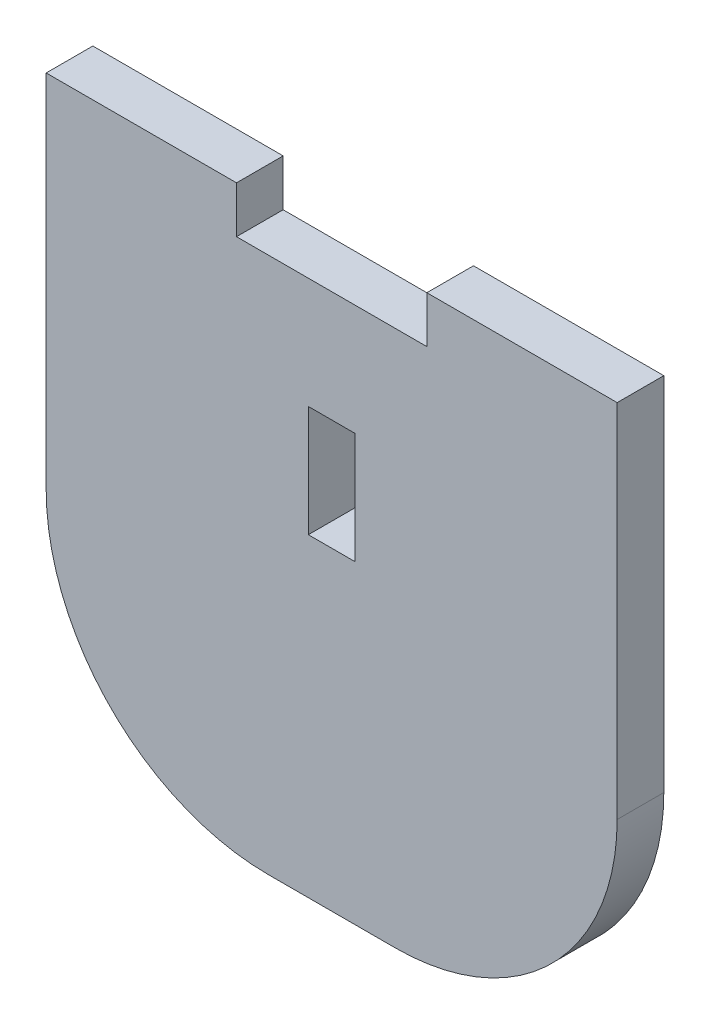
ISO-10303-21;
HEADER;
FILE_DESCRIPTION(('STEP AP214'),'2;1');
FILE_NAME('part.step','',(''),(''),'','','');
FILE_SCHEMA(('AUTOMOTIVE_DESIGN { 1 0 10303 214 1 1 1 1 }'));
ENDSEC;
DATA;
#1=APPLICATION_CONTEXT('core data for automotive mechanical design processes');
#2=APPLICATION_PROTOCOL_DEFINITION('international standard','automotive_design',2000,#1);
#3=PRODUCT_CONTEXT('',#1,'mechanical');
#4=PRODUCT('Part','Part','',(#3));
#5=PRODUCT_RELATED_PRODUCT_CATEGORY('part','',(#4));
#6=PRODUCT_DEFINITION_FORMATION('','',#4);
#7=PRODUCT_DEFINITION_CONTEXT('part definition',#1,'design');
#8=PRODUCT_DEFINITION('design','',#6,#7);
#9=PRODUCT_DEFINITION_SHAPE('','',#8);
#10=(LENGTH_UNIT() NAMED_UNIT(*) SI_UNIT(.MILLI.,.METRE.));
#11=(NAMED_UNIT(*) PLANE_ANGLE_UNIT() SI_UNIT($,.RADIAN.));
#12=(NAMED_UNIT(*) SI_UNIT($,.STERADIAN.) SOLID_ANGLE_UNIT());
#13=UNCERTAINTY_MEASURE_WITH_UNIT(LENGTH_MEASURE(1.E-05),#10,'distance_accuracy_value','');
#14=(GEOMETRIC_REPRESENTATION_CONTEXT(3) GLOBAL_UNCERTAINTY_ASSIGNED_CONTEXT((#13)) GLOBAL_UNIT_ASSIGNED_CONTEXT((#10,
#11,#12)) REPRESENTATION_CONTEXT('',''));
#15=CARTESIAN_POINT('',(0.,0.,0.));
#16=DIRECTION('',(0.,0.,1.));
#17=DIRECTION('',(1.,0.,0.));
#18=AXIS2_PLACEMENT_3D('',#15,#16,#17);
#19=CARTESIAN_POINT('',(-95.7751179129446,117.382455914664,5.334));
#20=DIRECTION('',(0.,-1.,0.));
#21=DIRECTION('',(0.,0.,-1.));
#22=AXIS2_PLACEMENT_3D('',#19,#20,#21);
#23=PLANE('',#22);
#24=DIRECTION('',(-1.,0.,0.));
#25=VECTOR('',#24,1.);
#26=CARTESIAN_POINT('',(-95.7751179129446,117.382455914664,5.334));
#27=LINE('',#26,#25);
#28=CARTESIAN_POINT('',(-74.0157845796113,117.382455914664,5.334));
#29=VERTEX_POINT('',#28);
#30=CARTESIAN_POINT('',(-95.7751179129446,117.382455914664,5.334));
#31=VERTEX_POINT('',#30);
#32=EDGE_CURVE('E205',#29,#31,#27,.T.);
#33=ORIENTED_EDGE('',*,*,#32,.F.);
#34=DIRECTION('',(0.,0.,1.));
#35=VECTOR('',#34,1.);
#36=CARTESIAN_POINT('',(-74.0157845796113,117.382455914664,0.));
#37=LINE('',#36,#35);
#38=CARTESIAN_POINT('',(-74.0157845796113,117.382455914664,0.));
#39=VERTEX_POINT('',#38);
#40=EDGE_CURVE('E187',#39,#29,#37,.T.);
#41=ORIENTED_EDGE('',*,*,#40,.F.);
#42=DIRECTION('',(-1.,0.,0.));
#43=VECTOR('',#42,1.);
#44=CARTESIAN_POINT('',(-95.7751179129446,117.382455914664,0.));
#45=LINE('',#44,#43);
#46=CARTESIAN_POINT('',(-95.7751179129446,117.382455914664,0.));
#47=VERTEX_POINT('',#46);
#48=EDGE_CURVE('E217',#39,#47,#45,.T.);
#49=ORIENTED_EDGE('',*,*,#48,.T.);
#50=DIRECTION('',(0.,0.,-1.));
#51=VECTOR('',#50,1.);
#52=CARTESIAN_POINT('',(-95.7751179129446,117.382455914664,5.334));
#53=LINE('',#52,#51);
#54=EDGE_CURVE('E209',#31,#47,#53,.T.);
#55=ORIENTED_EDGE('',*,*,#54,.F.);
#56=EDGE_LOOP('',(#33,#41,#49,#55));
#57=FACE_BOUND('',#56,.T.);
#58=ADVANCED_FACE('F33',(#57),#23,.F.);
#59=CARTESIAN_POINT('',(-95.7751179129446,117.382455914664,5.334));
#60=DIRECTION('',(1.,0.,0.));
#61=DIRECTION('',(0.,1.,0.));
#62=AXIS2_PLACEMENT_3D('',#59,#60,#61);
#63=PLANE('',#62);
#64=DIRECTION('',(0.,-1.,0.));
#65=VECTOR('',#64,1.);
#66=CARTESIAN_POINT('',(-95.7751179129446,117.382455914664,0.));
#67=LINE('',#66,#65);
#68=CARTESIAN_POINT('',(-95.7751179129446,76.107455914664,0.));
#69=VERTEX_POINT('',#68);
#70=EDGE_CURVE('E189',#47,#69,#67,.T.);
#71=ORIENTED_EDGE('',*,*,#70,.T.);
#72=DIRECTION('',(0.,0.,-1.));
#73=VECTOR('',#72,1.);
#74=CARTESIAN_POINT('',(-95.7751179129446,76.107455914664,5.334));
#75=LINE('',#74,#73);
#76=CARTESIAN_POINT('',(-95.7751179129446,76.107455914664,5.334));
#77=VERTEX_POINT('',#76);
#78=EDGE_CURVE('E230',#69,#77,#75,.F.);
#79=ORIENTED_EDGE('',*,*,#78,.T.);
#80=DIRECTION('',(0.,-1.,0.));
#81=VECTOR('',#80,1.);
#82=CARTESIAN_POINT('',(-95.7751179129446,117.382455914664,5.334));
#83=LINE('',#82,#81);
#84=EDGE_CURVE('E196',#31,#77,#83,.T.);
#85=ORIENTED_EDGE('',*,*,#84,.F.);
#86=ORIENTED_EDGE('',*,*,#54,.T.);
#87=EDGE_LOOP('',(#71,#79,#85,#86));
#88=FACE_BOUND('',#87,.T.);
#89=ADVANCED_FACE('F278',(#88),#63,.F.);
#90=CARTESIAN_POINT('',(-95.7751179129446,50.707455914664,5.334));
#91=DIRECTION('',(0.,1.,0.));
#92=DIRECTION('',(0.,0.,1.));
#93=AXIS2_PLACEMENT_3D('',#90,#91,#92);
#94=PLANE('',#93);
#95=DIRECTION('',(1.,0.,0.));
#96=VECTOR('',#95,1.);
#97=CARTESIAN_POINT('',(-95.7751179129446,50.707455914664,0.));
#98=LINE('',#97,#96);
#99=CARTESIAN_POINT('',(-70.3751179129446,50.707455914664,0.));
#100=VERTEX_POINT('',#99);
#101=CARTESIAN_POINT('',(-55.8971179129446,50.707455914664,0.));
#102=VERTEX_POINT('',#101);
#103=EDGE_CURVE('E212',#100,#102,#98,.T.);
#104=ORIENTED_EDGE('',*,*,#103,.T.);
#105=DIRECTION('',(0.,0.,-1.));
#106=VECTOR('',#105,1.);
#107=CARTESIAN_POINT('',(-55.8971179129446,50.707455914664,5.334));
#108=LINE('',#107,#106);
#109=CARTESIAN_POINT('',(-55.8971179129446,50.707455914664,5.334));
#110=VERTEX_POINT('',#109);
#111=EDGE_CURVE('E41',#102,#110,#108,.F.);
#112=ORIENTED_EDGE('',*,*,#111,.T.);
#113=DIRECTION('',(1.,0.,0.));
#114=VECTOR('',#113,1.);
#115=CARTESIAN_POINT('',(-95.7751179129446,50.707455914664,5.334));
#116=LINE('',#115,#114);
#117=CARTESIAN_POINT('',(-70.3751179129446,50.707455914664,5.334));
#118=VERTEX_POINT('',#117);
#119=EDGE_CURVE('E199',#118,#110,#116,.T.);
#120=ORIENTED_EDGE('',*,*,#119,.F.);
#121=DIRECTION('',(0.,0.,-1.));
#122=VECTOR('',#121,1.);
#123=CARTESIAN_POINT('',(-70.3751179129446,50.707455914664,5.334));
#124=LINE('',#123,#122);
#125=EDGE_CURVE('E225',#118,#100,#124,.T.);
#126=ORIENTED_EDGE('',*,*,#125,.T.);
#127=EDGE_LOOP('',(#104,#112,#120,#126));
#128=FACE_BOUND('',#127,.T.);
#129=ADVANCED_FACE('F241',(#128),#94,.F.);
#130=CARTESIAN_POINT('',(-30.4971179129446,117.382455914664,5.334));
#131=DIRECTION('',(-1.,0.,0.));
#132=DIRECTION('',(0.,-1.,0.));
#133=AXIS2_PLACEMENT_3D('',#130,#131,#132);
#134=PLANE('',#133);
#135=DIRECTION('',(0.,1.,0.));
#136=VECTOR('',#135,1.);
#137=CARTESIAN_POINT('',(-30.4971179129446,117.382455914664,5.334));
#138=LINE('',#137,#136);
#139=CARTESIAN_POINT('',(-30.4971179129446,76.107455914664,5.334));
#140=VERTEX_POINT('',#139);
#141=CARTESIAN_POINT('',(-30.4971179129446,117.382455914664,5.334));
#142=VERTEX_POINT('',#141);
#143=EDGE_CURVE('E203',#140,#142,#138,.T.);
#144=ORIENTED_EDGE('',*,*,#143,.F.);
#145=DIRECTION('',(0.,0.,-1.));
#146=VECTOR('',#145,1.);
#147=CARTESIAN_POINT('',(-30.4971179129446,76.107455914664,5.334));
#148=LINE('',#147,#146);
#149=CARTESIAN_POINT('',(-30.4971179129446,76.107455914664,0.));
#150=VERTEX_POINT('',#149);
#151=EDGE_CURVE('E234',#140,#150,#148,.T.);
#152=ORIENTED_EDGE('',*,*,#151,.T.);
#153=DIRECTION('',(0.,1.,0.));
#154=VECTOR('',#153,1.);
#155=CARTESIAN_POINT('',(-30.4971179129446,117.382455914664,0.));
#156=LINE('',#155,#154);
#157=CARTESIAN_POINT('',(-30.4971179129446,117.382455914664,0.));
#158=VERTEX_POINT('',#157);
#159=EDGE_CURVE('E215',#150,#158,#156,.T.);
#160=ORIENTED_EDGE('',*,*,#159,.T.);
#161=DIRECTION('',(0.,0.,-1.));
#162=VECTOR('',#161,1.);
#163=CARTESIAN_POINT('',(-30.4971179129446,117.382455914664,5.334));
#164=LINE('',#163,#162);
#165=EDGE_CURVE('E222',#142,#158,#164,.T.);
#166=ORIENTED_EDGE('',*,*,#165,.F.);
#167=EDGE_LOOP('',(#144,#152,#160,#166));
#168=FACE_BOUND('',#167,.T.);
#169=ADVANCED_FACE('F253',(#168),#134,.F.);
#170=CARTESIAN_POINT('',(-52.2564512462779,117.382455914664,0.));
#171=VERTEX_POINT('',#170);
#172=EDGE_CURVE('E200',#158,#171,#45,.T.);
#173=ORIENTED_EDGE('',*,*,#172,.T.);
#174=DIRECTION('',(0.,0.,1.));
#175=VECTOR('',#174,1.);
#176=CARTESIAN_POINT('',(-52.2564512462779,117.382455914664,0.));
#177=LINE('',#176,#175);
#178=CARTESIAN_POINT('',(-52.2564512462779,117.382455914664,5.334));
#179=VERTEX_POINT('',#178);
#180=EDGE_CURVE('E190',#171,#179,#177,.T.);
#181=ORIENTED_EDGE('',*,*,#180,.T.);
#182=EDGE_CURVE('E206',#142,#179,#27,.T.);
#183=ORIENTED_EDGE('',*,*,#182,.F.);
#184=ORIENTED_EDGE('',*,*,#165,.T.);
#185=EDGE_LOOP('',(#173,#181,#183,#184));
#186=FACE_BOUND('',#185,.T.);
#187=ADVANCED_FACE('F257',(#186),#23,.F.);
#188=CARTESIAN_POINT('',(0.,0.,5.334));
#189=DIRECTION('',(0.,0.,1.));
#190=DIRECTION('',(1.,0.,0.));
#191=AXIS2_PLACEMENT_3D('',#188,#189,#190);
#192=PLANE('',#191);
#193=DIRECTION('',(0.,-1.,0.));
#194=VECTOR('',#193,1.);
#195=CARTESIAN_POINT('',(-65.8031179129446,99.348455914664,5.334));
#196=LINE('',#195,#194);
#197=CARTESIAN_POINT('',(-65.8031179129446,99.348455914664,5.334));
#198=VERTEX_POINT('',#197);
#199=CARTESIAN_POINT('',(-65.8031179129446,86.648455914664,5.334));
#200=VERTEX_POINT('',#199);
#201=EDGE_CURVE('E48',#198,#200,#196,.T.);
#202=ORIENTED_EDGE('',*,*,#201,.F.);
#203=DIRECTION('',(-1.,0.,0.));
#204=VECTOR('',#203,1.);
#205=CARTESIAN_POINT('',(-65.8031179129446,99.348455914664,5.334));
#206=LINE('',#205,#204);
#207=CARTESIAN_POINT('',(-60.4691179129446,99.348455914664,5.334));
#208=VERTEX_POINT('',#207);
#209=EDGE_CURVE('E151',#208,#198,#206,.T.);
#210=ORIENTED_EDGE('',*,*,#209,.F.);
#211=DIRECTION('',(0.,1.,0.));
#212=VECTOR('',#211,1.);
#213=CARTESIAN_POINT('',(-60.4691179129446,99.348455914664,5.334));
#214=LINE('',#213,#212);
#215=CARTESIAN_POINT('',(-60.4691179129446,86.648455914664,5.334));
#216=VERTEX_POINT('',#215);
#217=EDGE_CURVE('E154',#216,#208,#214,.T.);
#218=ORIENTED_EDGE('',*,*,#217,.F.);
#219=DIRECTION('',(1.,0.,0.));
#220=VECTOR('',#219,1.);
#221=CARTESIAN_POINT('',(-65.8031179129446,86.648455914664,5.334));
#222=LINE('',#221,#220);
#223=EDGE_CURVE('E160',#200,#216,#222,.T.);
#224=ORIENTED_EDGE('',*,*,#223,.F.);
#225=EDGE_LOOP('',(#202,#210,#218,#224));
#226=FACE_BOUND('',#225,.T.);
#227=ORIENTED_EDGE('',*,*,#119,.T.);
#228=CARTESIAN_POINT('',(-55.8971179129446,76.107455914664,5.334));
#229=DIRECTION('',(0.,0.,1.));
#230=DIRECTION('',(1.,0.,0.));
#231=AXIS2_PLACEMENT_3D('',#228,#229,#230);
#232=CIRCLE('',#231,25.4);
#233=EDGE_CURVE('E11',#110,#140,#232,.T.);
#234=ORIENTED_EDGE('',*,*,#233,.T.);
#235=ORIENTED_EDGE('',*,*,#143,.T.);
#236=ORIENTED_EDGE('',*,*,#182,.T.);
#237=DIRECTION('',(0.,1.,0.));
#238=VECTOR('',#237,1.);
#239=CARTESIAN_POINT('',(-52.2564512462779,117.382455914664,5.334));
#240=LINE('',#239,#238);
#241=CARTESIAN_POINT('',(-52.2564512462779,112.048455914664,5.334));
#242=VERTEX_POINT('',#241);
#243=EDGE_CURVE('E174',#242,#179,#240,.T.);
#244=ORIENTED_EDGE('',*,*,#243,.F.);
#245=DIRECTION('',(1.,0.,0.));
#246=VECTOR('',#245,1.);
#247=CARTESIAN_POINT('',(-74.0157845796113,112.048455914664,5.334));
#248=LINE('',#247,#246);
#249=CARTESIAN_POINT('',(-74.0157845796113,112.048455914664,5.334));
#250=VERTEX_POINT('',#249);
#251=EDGE_CURVE('E183',#250,#242,#248,.T.);
#252=ORIENTED_EDGE('',*,*,#251,.F.);
#253=DIRECTION('',(0.,-1.,0.));
#254=VECTOR('',#253,1.);
#255=CARTESIAN_POINT('',(-74.0157845796113,117.382455914664,5.334));
#256=LINE('',#255,#254);
#257=EDGE_CURVE('E166',#29,#250,#256,.T.);
#258=ORIENTED_EDGE('',*,*,#257,.F.);
#259=ORIENTED_EDGE('',*,*,#32,.T.);
#260=ORIENTED_EDGE('',*,*,#84,.T.);
#261=CARTESIAN_POINT('',(-70.3751179129446,76.107455914664,5.334));
#262=DIRECTION('',(0.,0.,1.));
#263=DIRECTION('',(1.,0.,0.));
#264=AXIS2_PLACEMENT_3D('',#261,#262,#263);
#265=CIRCLE('',#264,25.4);
#266=EDGE_CURVE('E232',#77,#118,#265,.T.);
#267=ORIENTED_EDGE('',*,*,#266,.T.);
#268=EDGE_LOOP('',(#227,#234,#235,#236,#244,#252,#258,#259,#260,#267));
#269=FACE_BOUND('',#268,.T.);
#270=ADVANCED_FACE('F247',(#226,#269),#192,.T.);
#271=CARTESIAN_POINT('',(0.,0.,0.));
#272=DIRECTION('',(0.,0.,1.));
#273=DIRECTION('',(1.,0.,0.));
#274=AXIS2_PLACEMENT_3D('',#271,#272,#273);
#275=PLANE('',#274);
#276=DIRECTION('',(-1.,0.,0.));
#277=VECTOR('',#276,1.);
#278=CARTESIAN_POINT('',(-65.8031179129446,99.348455914664,0.));
#279=LINE('',#278,#277);
#280=CARTESIAN_POINT('',(-60.4691179129446,99.348455914664,0.));
#281=VERTEX_POINT('',#280);
#282=CARTESIAN_POINT('',(-65.8031179129446,99.348455914664,0.));
#283=VERTEX_POINT('',#282);
#284=EDGE_CURVE('E141',#281,#283,#279,.T.);
#285=ORIENTED_EDGE('',*,*,#284,.T.);
#286=DIRECTION('',(0.,-1.,0.));
#287=VECTOR('',#286,1.);
#288=CARTESIAN_POINT('',(-65.8031179129446,99.348455914664,0.));
#289=LINE('',#288,#287);
#290=CARTESIAN_POINT('',(-65.8031179129446,86.648455914664,0.));
#291=VERTEX_POINT('',#290);
#292=EDGE_CURVE('E135',#283,#291,#289,.T.);
#293=ORIENTED_EDGE('',*,*,#292,.T.);
#294=DIRECTION('',(1.,0.,0.));
#295=VECTOR('',#294,1.);
#296=CARTESIAN_POINT('',(-65.8031179129446,86.648455914664,0.));
#297=LINE('',#296,#295);
#298=CARTESIAN_POINT('',(-60.4691179129446,86.648455914664,0.));
#299=VERTEX_POINT('',#298);
#300=EDGE_CURVE('E144',#291,#299,#297,.T.);
#301=ORIENTED_EDGE('',*,*,#300,.T.);
#302=DIRECTION('',(0.,1.,0.));
#303=VECTOR('',#302,1.);
#304=CARTESIAN_POINT('',(-60.4691179129446,99.348455914664,0.));
#305=LINE('',#304,#303);
#306=EDGE_CURVE('E56',#299,#281,#305,.T.);
#307=ORIENTED_EDGE('',*,*,#306,.T.);
#308=EDGE_LOOP('',(#285,#293,#301,#307));
#309=FACE_BOUND('',#308,.T.);
#310=ORIENTED_EDGE('',*,*,#159,.F.);
#311=CARTESIAN_POINT('',(-55.8971179129446,76.107455914664,0.));
#312=DIRECTION('',(0.,0.,1.));
#313=DIRECTION('',(1.,0.,0.));
#314=AXIS2_PLACEMENT_3D('',#311,#312,#313);
#315=CIRCLE('',#314,25.4);
#316=EDGE_CURVE('E237',#150,#102,#315,.F.);
#317=ORIENTED_EDGE('',*,*,#316,.T.);
#318=ORIENTED_EDGE('',*,*,#103,.F.);
#319=CARTESIAN_POINT('',(-70.3751179129446,76.107455914664,0.));
#320=DIRECTION('',(0.,0.,1.));
#321=DIRECTION('',(1.,0.,0.));
#322=AXIS2_PLACEMENT_3D('',#319,#320,#321);
#323=CIRCLE('',#322,25.4);
#324=EDGE_CURVE('E228',#100,#69,#323,.F.);
#325=ORIENTED_EDGE('',*,*,#324,.T.);
#326=ORIENTED_EDGE('',*,*,#70,.F.);
#327=ORIENTED_EDGE('',*,*,#48,.F.);
#328=DIRECTION('',(0.,-1.,0.));
#329=VECTOR('',#328,1.);
#330=CARTESIAN_POINT('',(-74.0157845796113,117.382455914664,0.));
#331=LINE('',#330,#329);
#332=CARTESIAN_POINT('',(-74.0157845796113,112.048455914664,0.));
#333=VERTEX_POINT('',#332);
#334=EDGE_CURVE('E170',#39,#333,#331,.T.);
#335=ORIENTED_EDGE('',*,*,#334,.T.);
#336=DIRECTION('',(1.,0.,0.));
#337=VECTOR('',#336,1.);
#338=CARTESIAN_POINT('',(-74.0157845796113,112.048455914664,0.));
#339=LINE('',#338,#337);
#340=CARTESIAN_POINT('',(-52.2564512462779,112.048455914664,0.));
#341=VERTEX_POINT('',#340);
#342=EDGE_CURVE('E173',#333,#341,#339,.T.);
#343=ORIENTED_EDGE('',*,*,#342,.T.);
#344=DIRECTION('',(0.,1.,0.));
#345=VECTOR('',#344,1.);
#346=CARTESIAN_POINT('',(-52.2564512462779,117.382455914664,0.));
#347=LINE('',#346,#345);
#348=EDGE_CURVE('E177',#341,#171,#347,.T.);
#349=ORIENTED_EDGE('',*,*,#348,.T.);
#350=ORIENTED_EDGE('',*,*,#172,.F.);
#351=EDGE_LOOP('',(#310,#317,#318,#325,#326,#327,#335,#343,#349,#350));
#352=FACE_BOUND('',#351,.T.);
#353=ADVANCED_FACE('F148',(#309,#352),#275,.F.);
#354=CARTESIAN_POINT('',(-74.0157845796113,117.382455914664,0.));
#355=DIRECTION('',(-1.,0.,0.));
#356=DIRECTION('',(0.,0.,1.));
#357=AXIS2_PLACEMENT_3D('',#354,#355,#356);
#358=PLANE('',#357);
#359=ORIENTED_EDGE('',*,*,#257,.T.);
#360=DIRECTION('',(0.,0.,1.));
#361=VECTOR('',#360,1.);
#362=CARTESIAN_POINT('',(-74.0157845796113,112.048455914664,0.));
#363=LINE('',#362,#361);
#364=EDGE_CURVE('E180',#333,#250,#363,.T.);
#365=ORIENTED_EDGE('',*,*,#364,.F.);
#366=ORIENTED_EDGE('',*,*,#334,.F.);
#367=ORIENTED_EDGE('',*,*,#40,.T.);
#368=EDGE_LOOP('',(#359,#365,#366,#367));
#369=FACE_BOUND('',#368,.T.);
#370=ADVANCED_FACE('F269',(#369),#358,.F.);
#371=CARTESIAN_POINT('',(-52.2564512462779,117.382455914664,0.));
#372=DIRECTION('',(1.,0.,0.));
#373=DIRECTION('',(0.,0.,-1.));
#374=AXIS2_PLACEMENT_3D('',#371,#372,#373);
#375=PLANE('',#374);
#376=ORIENTED_EDGE('',*,*,#243,.T.);
#377=ORIENTED_EDGE('',*,*,#180,.F.);
#378=ORIENTED_EDGE('',*,*,#348,.F.);
#379=DIRECTION('',(0.,0.,1.));
#380=VECTOR('',#379,1.);
#381=CARTESIAN_POINT('',(-52.2564512462779,112.048455914664,0.));
#382=LINE('',#381,#380);
#383=EDGE_CURVE('E193',#341,#242,#382,.T.);
#384=ORIENTED_EDGE('',*,*,#383,.T.);
#385=EDGE_LOOP('',(#376,#377,#378,#384));
#386=FACE_BOUND('',#385,.T.);
#387=ADVANCED_FACE('F263',(#386),#375,.F.);
#388=CARTESIAN_POINT('',(-74.0157845796113,112.048455914664,0.));
#389=DIRECTION('',(0.,-1.,0.));
#390=DIRECTION('',(0.,0.,-1.));
#391=AXIS2_PLACEMENT_3D('',#388,#389,#390);
#392=PLANE('',#391);
#393=ORIENTED_EDGE('',*,*,#251,.T.);
#394=ORIENTED_EDGE('',*,*,#383,.F.);
#395=ORIENTED_EDGE('',*,*,#342,.F.);
#396=ORIENTED_EDGE('',*,*,#364,.T.);
#397=EDGE_LOOP('',(#393,#394,#395,#396));
#398=FACE_BOUND('',#397,.T.);
#399=ADVANCED_FACE('F267',(#398),#392,.F.);
#400=CARTESIAN_POINT('',(-70.3751179129446,76.107455914664,5.334));
#401=DIRECTION('',(0.,0.,-1.));
#402=DIRECTION('',(-1.,0.,0.));
#403=AXIS2_PLACEMENT_3D('',#400,#401,#402);
#404=CYLINDRICAL_SURFACE('',#403,25.4);
#405=ORIENTED_EDGE('',*,*,#266,.F.);
#406=ORIENTED_EDGE('',*,*,#78,.F.);
#407=ORIENTED_EDGE('',*,*,#324,.F.);
#408=ORIENTED_EDGE('',*,*,#125,.F.);
#409=EDGE_LOOP('',(#405,#406,#407,#408));
#410=FACE_BOUND('',#409,.T.);
#411=ADVANCED_FACE('F281',(#410),#404,.T.);
#412=CARTESIAN_POINT('',(-55.8971179129446,76.107455914664,5.334));
#413=DIRECTION('',(0.,0.,-1.));
#414=DIRECTION('',(-1.,0.,0.));
#415=AXIS2_PLACEMENT_3D('',#412,#413,#414);
#416=CYLINDRICAL_SURFACE('',#415,25.4);
#417=ORIENTED_EDGE('',*,*,#233,.F.);
#418=ORIENTED_EDGE('',*,*,#111,.F.);
#419=ORIENTED_EDGE('',*,*,#316,.F.);
#420=ORIENTED_EDGE('',*,*,#151,.F.);
#421=EDGE_LOOP('',(#417,#418,#419,#420));
#422=FACE_BOUND('',#421,.T.);
#423=ADVANCED_FACE('F35',(#422),#416,.T.);
#424=CARTESIAN_POINT('',(-65.8031179129446,99.348455914664,0.));
#425=DIRECTION('',(-1.,0.,0.));
#426=DIRECTION('',(0.,0.,1.));
#427=AXIS2_PLACEMENT_3D('',#424,#425,#426);
#428=PLANE('',#427);
#429=ORIENTED_EDGE('',*,*,#201,.T.);
#430=DIRECTION('',(0.,0.,1.));
#431=VECTOR('',#430,1.);
#432=CARTESIAN_POINT('',(-65.8031179129446,86.648455914664,0.));
#433=LINE('',#432,#431);
#434=EDGE_CURVE('E131',#291,#200,#433,.T.);
#435=ORIENTED_EDGE('',*,*,#434,.F.);
#436=ORIENTED_EDGE('',*,*,#292,.F.);
#437=DIRECTION('',(0.,0.,1.));
#438=VECTOR('',#437,1.);
#439=CARTESIAN_POINT('',(-65.8031179129446,99.348455914664,0.));
#440=LINE('',#439,#438);
#441=EDGE_CURVE('E164',#283,#198,#440,.T.);
#442=ORIENTED_EDGE('',*,*,#441,.T.);
#443=EDGE_LOOP('',(#429,#435,#436,#442));
#444=FACE_BOUND('',#443,.T.);
#445=ADVANCED_FACE('F133',(#444),#428,.F.);
#446=CARTESIAN_POINT('',(-65.8031179129446,99.348455914664,0.));
#447=DIRECTION('',(0.,1.,0.));
#448=DIRECTION('',(0.,0.,1.));
#449=AXIS2_PLACEMENT_3D('',#446,#447,#448);
#450=PLANE('',#449);
#451=ORIENTED_EDGE('',*,*,#209,.T.);
#452=ORIENTED_EDGE('',*,*,#441,.F.);
#453=ORIENTED_EDGE('',*,*,#284,.F.);
#454=DIRECTION('',(0.,0.,1.));
#455=VECTOR('',#454,1.);
#456=CARTESIAN_POINT('',(-60.4691179129446,99.348455914664,0.));
#457=LINE('',#456,#455);
#458=EDGE_CURVE('E167',#281,#208,#457,.T.);
#459=ORIENTED_EDGE('',*,*,#458,.T.);
#460=EDGE_LOOP('',(#451,#452,#453,#459));
#461=FACE_BOUND('',#460,.T.);
#462=ADVANCED_FACE('F340',(#461),#450,.F.);
#463=CARTESIAN_POINT('',(-60.4691179129446,99.348455914664,0.));
#464=DIRECTION('',(1.,0.,0.));
#465=DIRECTION('',(0.,1.,0.));
#466=AXIS2_PLACEMENT_3D('',#463,#464,#465);
#467=PLANE('',#466);
#468=ORIENTED_EDGE('',*,*,#217,.T.);
#469=ORIENTED_EDGE('',*,*,#458,.F.);
#470=ORIENTED_EDGE('',*,*,#306,.F.);
#471=DIRECTION('',(0.,0.,1.));
#472=VECTOR('',#471,1.);
#473=CARTESIAN_POINT('',(-60.4691179129446,86.648455914664,0.));
#474=LINE('',#473,#472);
#475=EDGE_CURVE('E140',#299,#216,#474,.T.);
#476=ORIENTED_EDGE('',*,*,#475,.T.);
#477=EDGE_LOOP('',(#468,#469,#470,#476));
#478=FACE_BOUND('',#477,.T.);
#479=ADVANCED_FACE('F349',(#478),#467,.F.);
#480=CARTESIAN_POINT('',(-65.8031179129446,86.648455914664,0.));
#481=DIRECTION('',(0.,-1.,0.));
#482=DIRECTION('',(0.,0.,-1.));
#483=AXIS2_PLACEMENT_3D('',#480,#481,#482);
#484=PLANE('',#483);
#485=ORIENTED_EDGE('',*,*,#223,.T.);
#486=ORIENTED_EDGE('',*,*,#475,.F.);
#487=ORIENTED_EDGE('',*,*,#300,.F.);
#488=ORIENTED_EDGE('',*,*,#434,.T.);
#489=EDGE_LOOP('',(#485,#486,#487,#488));
#490=FACE_BOUND('',#489,.T.);
#491=ADVANCED_FACE('F145',(#490),#484,.F.);
#492=CLOSED_SHELL('',(#58,#89,#129,#169,#187,#270,#353,#370,#387,#399,#411,#423,#445,#462,#479,#491));
#493=MANIFOLD_SOLID_BREP('B2',#492);
#494=ADVANCED_BREP_SHAPE_REPRESENTATION('',(#18,#493),#14);
#495=SHAPE_DEFINITION_REPRESENTATION(#9,#494);
ENDSEC;
END-ISO-10303-21;
